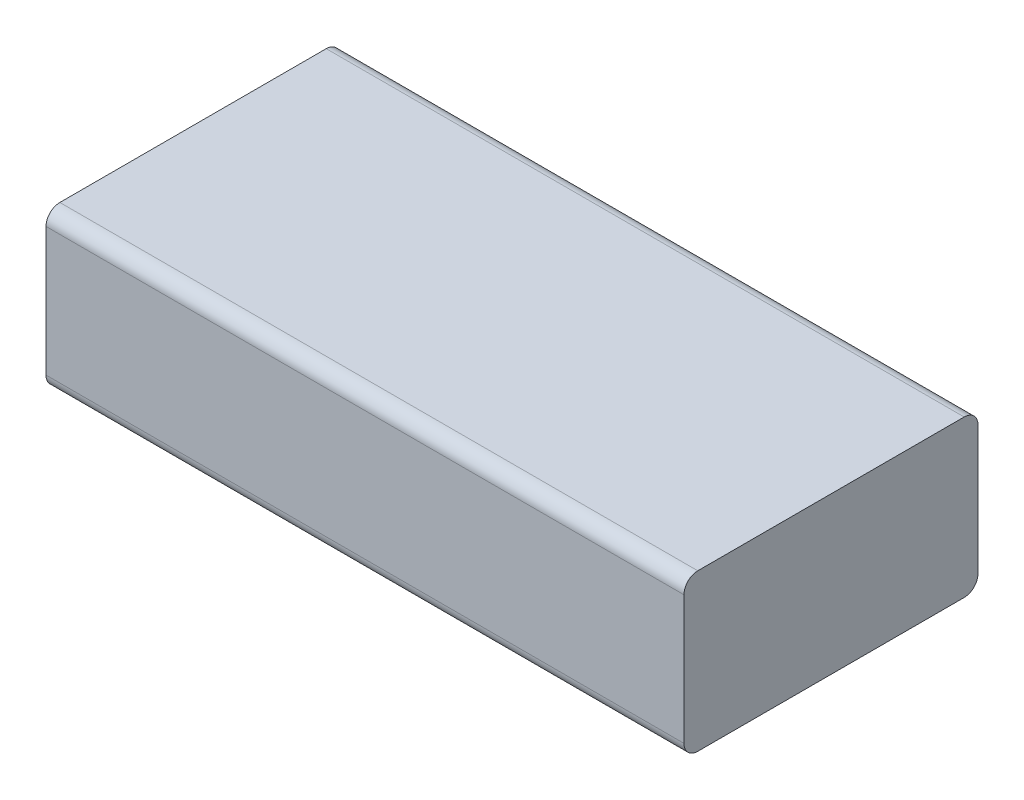
ISO-10303-21;
HEADER;
FILE_DESCRIPTION(('STEP AP214'),'2;1');
FILE_NAME('part.step','',(''),(''),'','','');
FILE_SCHEMA(('AUTOMOTIVE_DESIGN { 1 0 10303 214 1 1 1 1 }'));
ENDSEC;
DATA;
#1=APPLICATION_CONTEXT('core data for automotive mechanical design processes');
#2=APPLICATION_PROTOCOL_DEFINITION('international standard','automotive_design',2000,#1);
#3=PRODUCT_CONTEXT('',#1,'mechanical');
#4=PRODUCT('Part','Part','',(#3));
#5=PRODUCT_RELATED_PRODUCT_CATEGORY('part','',(#4));
#6=PRODUCT_DEFINITION_FORMATION('','',#4);
#7=PRODUCT_DEFINITION_CONTEXT('part definition',#1,'design');
#8=PRODUCT_DEFINITION('design','',#6,#7);
#9=PRODUCT_DEFINITION_SHAPE('','',#8);
#10=(LENGTH_UNIT() NAMED_UNIT(*) SI_UNIT(.MILLI.,.METRE.));
#11=(NAMED_UNIT(*) PLANE_ANGLE_UNIT() SI_UNIT($,.RADIAN.));
#12=(NAMED_UNIT(*) SI_UNIT($,.STERADIAN.) SOLID_ANGLE_UNIT());
#13=UNCERTAINTY_MEASURE_WITH_UNIT(LENGTH_MEASURE(1.E-05),#10,'distance_accuracy_value','');
#14=(GEOMETRIC_REPRESENTATION_CONTEXT(3) GLOBAL_UNCERTAINTY_ASSIGNED_CONTEXT((#13)) GLOBAL_UNIT_ASSIGNED_CONTEXT((#10,
#11,#12)) REPRESENTATION_CONTEXT('',''));
#15=CARTESIAN_POINT('',(0.,0.,0.));
#16=DIRECTION('',(0.,0.,1.));
#17=DIRECTION('',(1.,0.,0.));
#18=AXIS2_PLACEMENT_3D('',#15,#16,#17);
#19=CARTESIAN_POINT('',(-46.1,22.6,21.25));
#20=DIRECTION('',(1.,0.,0.));
#21=DIRECTION('',(0.,0.,-1.));
#22=AXIS2_PLACEMENT_3D('',#19,#20,#21);
#23=PLANE('',#22);
#24=DIRECTION('',(0.,-1.,0.));
#25=VECTOR('',#24,1.);
#26=CARTESIAN_POINT('',(-46.1,22.6,-21.25));
#27=LINE('',#26,#25);
#28=CARTESIAN_POINT('',(-46.1,20.6,-21.25));
#29=VERTEX_POINT('',#28);
#30=CARTESIAN_POINT('',(-46.1,2.,-21.25));
#31=VERTEX_POINT('',#30);
#32=EDGE_CURVE('E184',#29,#31,#27,.T.);
#33=ORIENTED_EDGE('',*,*,#32,.T.);
#34=CARTESIAN_POINT('',(-46.1,2.,-19.25));
#35=DIRECTION('',(1.,0.,0.));
#36=DIRECTION('',(0.,0.,-1.));
#37=AXIS2_PLACEMENT_3D('',#34,#35,#36);
#38=CIRCLE('',#37,2.);
#39=CARTESIAN_POINT('',(-46.1,0.,-19.25));
#40=VERTEX_POINT('',#39);
#41=EDGE_CURVE('E201',#31,#40,#38,.F.);
#42=ORIENTED_EDGE('',*,*,#41,.T.);
#43=DIRECTION('',(0.,0.,1.));
#44=VECTOR('',#43,1.);
#45=CARTESIAN_POINT('',(-46.1,0.,21.25));
#46=LINE('',#45,#44);
#47=CARTESIAN_POINT('',(-46.1,0.,19.25));
#48=VERTEX_POINT('',#47);
#49=EDGE_CURVE('E171',#40,#48,#46,.T.);
#50=ORIENTED_EDGE('',*,*,#49,.T.);
#51=CARTESIAN_POINT('',(-46.1,2.,19.25));
#52=DIRECTION('',(1.,0.,0.));
#53=DIRECTION('',(0.,0.,-1.));
#54=AXIS2_PLACEMENT_3D('',#51,#52,#53);
#55=CIRCLE('',#54,2.);
#56=CARTESIAN_POINT('',(-46.1,2.,21.25));
#57=VERTEX_POINT('',#56);
#58=EDGE_CURVE('E199',#48,#57,#55,.F.);
#59=ORIENTED_EDGE('',*,*,#58,.T.);
#60=DIRECTION('',(0.,-1.,0.));
#61=VECTOR('',#60,1.);
#62=CARTESIAN_POINT('',(-46.1,22.6,21.25));
#63=LINE('',#62,#61);
#64=CARTESIAN_POINT('',(-46.1,20.6,21.25));
#65=VERTEX_POINT('',#64);
#66=EDGE_CURVE('E181',#65,#57,#63,.T.);
#67=ORIENTED_EDGE('',*,*,#66,.F.);
#68=CARTESIAN_POINT('',(-46.1,20.6,19.25));
#69=DIRECTION('',(1.,0.,0.));
#70=DIRECTION('',(0.,0.,-1.));
#71=AXIS2_PLACEMENT_3D('',#68,#69,#70);
#72=CIRCLE('',#71,2.);
#73=CARTESIAN_POINT('',(-46.1,22.6,19.25));
#74=VERTEX_POINT('',#73);
#75=EDGE_CURVE('E195',#65,#74,#72,.F.);
#76=ORIENTED_EDGE('',*,*,#75,.T.);
#77=DIRECTION('',(0.,0.,1.));
#78=VECTOR('',#77,1.);
#79=CARTESIAN_POINT('',(-46.1,22.6,21.25));
#80=LINE('',#79,#78);
#81=CARTESIAN_POINT('',(-46.1,22.6,-19.25));
#82=VERTEX_POINT('',#81);
#83=EDGE_CURVE('E170',#82,#74,#80,.T.);
#84=ORIENTED_EDGE('',*,*,#83,.F.);
#85=CARTESIAN_POINT('',(-46.1,20.6,-19.25));
#86=DIRECTION('',(1.,0.,0.));
#87=DIRECTION('',(0.,0.,-1.));
#88=AXIS2_PLACEMENT_3D('',#85,#86,#87);
#89=CIRCLE('',#88,2.);
#90=EDGE_CURVE('E197',#82,#29,#89,.F.);
#91=ORIENTED_EDGE('',*,*,#90,.T.);
#92=EDGE_LOOP('',(#33,#42,#50,#59,#67,#76,#84,#91));
#93=FACE_BOUND('',#92,.T.);
#94=CARTESIAN_POINT('',(-46.1,4.,-16.));
#95=DIRECTION('',(1.,0.,0.));
#96=DIRECTION('',(0.,0.,-1.));
#97=AXIS2_PLACEMENT_3D('',#94,#95,#96);
#98=CIRCLE('',#97,1.5);
#99=CARTESIAN_POINT('',(-46.1,4.,-17.5));
#100=VERTEX_POINT('',#99);
#101=EDGE_CURVE('E11',#100,#100,#98,.F.);
#102=ORIENTED_EDGE('',*,*,#101,.F.);
#103=EDGE_LOOP('',(#102));
#104=FACE_BOUND('',#103,.T.);
#105=DIRECTION('',(0.,0.,1.));
#106=VECTOR('',#105,1.);
#107=CARTESIAN_POINT('',(-46.1,11.6,0.));
#108=LINE('',#107,#106);
#109=CARTESIAN_POINT('',(-46.1,11.6,0.));
#110=VERTEX_POINT('',#109);
#111=CARTESIAN_POINT('',(-46.1,11.6,15.));
#112=VERTEX_POINT('',#111);
#113=EDGE_CURVE('E156',#110,#112,#108,.T.);
#114=ORIENTED_EDGE('',*,*,#113,.F.);
#115=DIRECTION('',(0.,1.,0.));
#116=VECTOR('',#115,1.);
#117=CARTESIAN_POINT('',(-46.1,0.,0.));
#118=LINE('',#117,#116);
#119=CARTESIAN_POINT('',(-46.1,17.6,0.));
#120=VERTEX_POINT('',#119);
#121=EDGE_CURVE('E152',#110,#120,#118,.T.);
#122=ORIENTED_EDGE('',*,*,#121,.T.);
#123=DIRECTION('',(0.,0.,1.));
#124=VECTOR('',#123,1.);
#125=CARTESIAN_POINT('',(-46.1,17.6,0.));
#126=LINE('',#125,#124);
#127=CARTESIAN_POINT('',(-46.1,17.6,15.));
#128=VERTEX_POINT('',#127);
#129=EDGE_CURVE('E58',#120,#128,#126,.T.);
#130=ORIENTED_EDGE('',*,*,#129,.T.);
#131=DIRECTION('',(0.,1.,0.));
#132=VECTOR('',#131,1.);
#133=CARTESIAN_POINT('',(-46.1,0.,15.));
#134=LINE('',#133,#132);
#135=EDGE_CURVE('E383',#112,#128,#134,.T.);
#136=ORIENTED_EDGE('',*,*,#135,.F.);
#137=EDGE_LOOP('',(#114,#122,#130,#136));
#138=FACE_BOUND('',#137,.T.);
#139=ADVANCED_FACE('F43',(#93,#104,#138),#23,.F.);
#140=CARTESIAN_POINT('',(46.1,22.6,21.25));
#141=DIRECTION('',(-1.,0.,0.));
#142=DIRECTION('',(0.,0.,1.));
#143=AXIS2_PLACEMENT_3D('',#140,#141,#142);
#144=PLANE('',#143);
#145=DIRECTION('',(0.,0.,-1.));
#146=VECTOR('',#145,1.);
#147=CARTESIAN_POINT('',(46.1,0.,21.25));
#148=LINE('',#147,#146);
#149=CARTESIAN_POINT('',(46.1,0.,19.25));
#150=VERTEX_POINT('',#149);
#151=CARTESIAN_POINT('',(46.1,0.,-19.25));
#152=VERTEX_POINT('',#151);
#153=EDGE_CURVE('E161',#150,#152,#148,.T.);
#154=ORIENTED_EDGE('',*,*,#153,.T.);
#155=CARTESIAN_POINT('',(46.1,2.,-19.25));
#156=DIRECTION('',(-1.,0.,0.));
#157=DIRECTION('',(0.,0.,1.));
#158=AXIS2_PLACEMENT_3D('',#155,#156,#157);
#159=CIRCLE('',#158,2.);
#160=CARTESIAN_POINT('',(46.1,2.,-21.25));
#161=VERTEX_POINT('',#160);
#162=EDGE_CURVE('E212',#152,#161,#159,.F.);
#163=ORIENTED_EDGE('',*,*,#162,.T.);
#164=DIRECTION('',(0.,-1.,0.));
#165=VECTOR('',#164,1.);
#166=CARTESIAN_POINT('',(46.1,22.6,-21.25));
#167=LINE('',#166,#165);
#168=CARTESIAN_POINT('',(46.1,20.6,-21.25));
#169=VERTEX_POINT('',#168);
#170=EDGE_CURVE('E187',#169,#161,#167,.T.);
#171=ORIENTED_EDGE('',*,*,#170,.F.);
#172=CARTESIAN_POINT('',(46.1,20.6,-19.25));
#173=DIRECTION('',(-1.,0.,0.));
#174=DIRECTION('',(0.,0.,1.));
#175=AXIS2_PLACEMENT_3D('',#172,#173,#174);
#176=CIRCLE('',#175,2.);
#177=CARTESIAN_POINT('',(46.1,22.6,-19.25));
#178=VERTEX_POINT('',#177);
#179=EDGE_CURVE('E209',#169,#178,#176,.F.);
#180=ORIENTED_EDGE('',*,*,#179,.T.);
#181=DIRECTION('',(0.,0.,-1.));
#182=VECTOR('',#181,1.);
#183=CARTESIAN_POINT('',(46.1,22.6,21.25));
#184=LINE('',#183,#182);
#185=CARTESIAN_POINT('',(46.1,22.6,19.25));
#186=VERTEX_POINT('',#185);
#187=EDGE_CURVE('E167',#186,#178,#184,.T.);
#188=ORIENTED_EDGE('',*,*,#187,.F.);
#189=CARTESIAN_POINT('',(46.1,20.6,19.25));
#190=DIRECTION('',(-1.,0.,0.));
#191=DIRECTION('',(0.,0.,1.));
#192=AXIS2_PLACEMENT_3D('',#189,#190,#191);
#193=CIRCLE('',#192,2.);
#194=CARTESIAN_POINT('',(46.1,20.6,21.25));
#195=VERTEX_POINT('',#194);
#196=EDGE_CURVE('E207',#186,#195,#193,.F.);
#197=ORIENTED_EDGE('',*,*,#196,.T.);
#198=DIRECTION('',(0.,-1.,0.));
#199=VECTOR('',#198,1.);
#200=CARTESIAN_POINT('',(46.1,22.6,21.25));
#201=LINE('',#200,#199);
#202=CARTESIAN_POINT('',(46.1,2.,21.25));
#203=VERTEX_POINT('',#202);
#204=EDGE_CURVE('E174',#195,#203,#201,.T.);
#205=ORIENTED_EDGE('',*,*,#204,.T.);
#206=CARTESIAN_POINT('',(46.1,2.,19.25));
#207=DIRECTION('',(-1.,0.,0.));
#208=DIRECTION('',(0.,0.,1.));
#209=AXIS2_PLACEMENT_3D('',#206,#207,#208);
#210=CIRCLE('',#209,2.);
#211=EDGE_CURVE('E66',#203,#150,#210,.F.);
#212=ORIENTED_EDGE('',*,*,#211,.T.);
#213=EDGE_LOOP('',(#154,#163,#171,#180,#188,#197,#205,#212));
#214=FACE_BOUND('',#213,.T.);
#215=ADVANCED_FACE('F237',(#214),#144,.F.);
#216=CARTESIAN_POINT('',(-46.1,22.6,-21.25));
#217=DIRECTION('',(0.,0.,1.));
#218=DIRECTION('',(1.,0.,0.));
#219=AXIS2_PLACEMENT_3D('',#216,#217,#218);
#220=PLANE('',#219);
#221=ORIENTED_EDGE('',*,*,#170,.T.);
#222=DIRECTION('',(-1.,0.,0.));
#223=VECTOR('',#222,1.);
#224=CARTESIAN_POINT('',(-46.1,2.,-21.25));
#225=LINE('',#224,#223);
#226=EDGE_CURVE('E192',#161,#31,#225,.T.);
#227=ORIENTED_EDGE('',*,*,#226,.T.);
#228=ORIENTED_EDGE('',*,*,#32,.F.);
#229=DIRECTION('',(-1.,0.,0.));
#230=VECTOR('',#229,1.);
#231=CARTESIAN_POINT('',(-46.1,20.6,-21.25));
#232=LINE('',#231,#230);
#233=EDGE_CURVE('E190',#29,#169,#232,.F.);
#234=ORIENTED_EDGE('',*,*,#233,.T.);
#235=EDGE_LOOP('',(#221,#227,#228,#234));
#236=FACE_BOUND('',#235,.T.);
#237=ADVANCED_FACE('F243',(#236),#220,.F.);
#238=CARTESIAN_POINT('',(-46.1,22.6,21.25));
#239=DIRECTION('',(0.,0.,-1.));
#240=DIRECTION('',(-1.,0.,0.));
#241=AXIS2_PLACEMENT_3D('',#238,#239,#240);
#242=PLANE('',#241);
#243=ORIENTED_EDGE('',*,*,#66,.T.);
#244=DIRECTION('',(1.,0.,0.));
#245=VECTOR('',#244,1.);
#246=CARTESIAN_POINT('',(46.1,2.,21.25));
#247=LINE('',#246,#245);
#248=EDGE_CURVE('E216',#57,#203,#247,.T.);
#249=ORIENTED_EDGE('',*,*,#248,.T.);
#250=ORIENTED_EDGE('',*,*,#204,.F.);
#251=DIRECTION('',(1.,0.,0.));
#252=VECTOR('',#251,1.);
#253=CARTESIAN_POINT('',(-46.1,20.6,21.25));
#254=LINE('',#253,#252);
#255=EDGE_CURVE('E214',#195,#65,#254,.F.);
#256=ORIENTED_EDGE('',*,*,#255,.T.);
#257=EDGE_LOOP('',(#243,#249,#250,#256));
#258=FACE_BOUND('',#257,.T.);
#259=ADVANCED_FACE('F256',(#258),#242,.F.);
#260=CARTESIAN_POINT('',(0.,22.6,0.));
#261=DIRECTION('',(0.,-1.,0.));
#262=DIRECTION('',(0.,0.,-1.));
#263=AXIS2_PLACEMENT_3D('',#260,#261,#262);
#264=PLANE('',#263);
#265=ORIENTED_EDGE('',*,*,#187,.T.);
#266=DIRECTION('',(-1.,0.,0.));
#267=VECTOR('',#266,1.);
#268=CARTESIAN_POINT('',(0.,22.6,-19.25));
#269=LINE('',#268,#267);
#270=EDGE_CURVE('E51',#178,#82,#269,.T.);
#271=ORIENTED_EDGE('',*,*,#270,.T.);
#272=ORIENTED_EDGE('',*,*,#83,.T.);
#273=DIRECTION('',(1.,0.,0.));
#274=VECTOR('',#273,1.);
#275=CARTESIAN_POINT('',(0.,22.6,19.25));
#276=LINE('',#275,#274);
#277=EDGE_CURVE('E218',#74,#186,#276,.T.);
#278=ORIENTED_EDGE('',*,*,#277,.T.);
#279=EDGE_LOOP('',(#265,#271,#272,#278));
#280=FACE_BOUND('',#279,.T.);
#281=ADVANCED_FACE('F224',(#280),#264,.F.);
#282=CARTESIAN_POINT('',(0.,0.,0.));
#283=DIRECTION('',(0.,-1.,0.));
#284=DIRECTION('',(0.,0.,-1.));
#285=AXIS2_PLACEMENT_3D('',#282,#283,#284);
#286=PLANE('',#285);
#287=ORIENTED_EDGE('',*,*,#49,.F.);
#288=DIRECTION('',(-1.,0.,0.));
#289=VECTOR('',#288,1.);
#290=CARTESIAN_POINT('',(46.1,0.,-19.25));
#291=LINE('',#290,#289);
#292=EDGE_CURVE('E205',#40,#152,#291,.F.);
#293=ORIENTED_EDGE('',*,*,#292,.T.);
#294=ORIENTED_EDGE('',*,*,#153,.F.);
#295=DIRECTION('',(1.,0.,0.));
#296=VECTOR('',#295,1.);
#297=CARTESIAN_POINT('',(-46.1,0.,19.25));
#298=LINE('',#297,#296);
#299=EDGE_CURVE('E203',#150,#48,#298,.F.);
#300=ORIENTED_EDGE('',*,*,#299,.T.);
#301=EDGE_LOOP('',(#287,#293,#294,#300));
#302=FACE_BOUND('',#301,.T.);
#303=ADVANCED_FACE('F250',(#302),#286,.T.);
#304=CARTESIAN_POINT('',(-46.1,2.,-19.25));
#305=DIRECTION('',(1.,0.,0.));
#306=DIRECTION('',(0.,0.,-1.));
#307=AXIS2_PLACEMENT_3D('',#304,#305,#306);
#308=CYLINDRICAL_SURFACE('',#307,2.);
#309=ORIENTED_EDGE('',*,*,#162,.F.);
#310=ORIENTED_EDGE('',*,*,#292,.F.);
#311=ORIENTED_EDGE('',*,*,#41,.F.);
#312=ORIENTED_EDGE('',*,*,#226,.F.);
#313=EDGE_LOOP('',(#309,#310,#311,#312));
#314=FACE_BOUND('',#313,.T.);
#315=ADVANCED_FACE('F253',(#314),#308,.T.);
#316=CARTESIAN_POINT('',(-46.1,2.,19.25));
#317=DIRECTION('',(-1.,0.,0.));
#318=DIRECTION('',(0.,0.,1.));
#319=AXIS2_PLACEMENT_3D('',#316,#317,#318);
#320=CYLINDRICAL_SURFACE('',#319,2.);
#321=ORIENTED_EDGE('',*,*,#58,.F.);
#322=ORIENTED_EDGE('',*,*,#299,.F.);
#323=ORIENTED_EDGE('',*,*,#211,.F.);
#324=ORIENTED_EDGE('',*,*,#248,.F.);
#325=EDGE_LOOP('',(#321,#322,#323,#324));
#326=FACE_BOUND('',#325,.T.);
#327=ADVANCED_FACE('F254',(#326),#320,.T.);
#328=CARTESIAN_POINT('',(0.,20.6,-19.25));
#329=DIRECTION('',(-1.,0.,0.));
#330=DIRECTION('',(0.,0.,1.));
#331=AXIS2_PLACEMENT_3D('',#328,#329,#330);
#332=CYLINDRICAL_SURFACE('',#331,2.);
#333=ORIENTED_EDGE('',*,*,#179,.F.);
#334=ORIENTED_EDGE('',*,*,#233,.F.);
#335=ORIENTED_EDGE('',*,*,#90,.F.);
#336=ORIENTED_EDGE('',*,*,#270,.F.);
#337=EDGE_LOOP('',(#333,#334,#335,#336));
#338=FACE_BOUND('',#337,.T.);
#339=ADVANCED_FACE('F241',(#338),#332,.T.);
#340=CARTESIAN_POINT('',(0.,20.6,19.25));
#341=DIRECTION('',(1.,0.,0.));
#342=DIRECTION('',(0.,0.,-1.));
#343=AXIS2_PLACEMENT_3D('',#340,#341,#342);
#344=CYLINDRICAL_SURFACE('',#343,2.);
#345=ORIENTED_EDGE('',*,*,#75,.F.);
#346=ORIENTED_EDGE('',*,*,#255,.F.);
#347=ORIENTED_EDGE('',*,*,#196,.F.);
#348=ORIENTED_EDGE('',*,*,#277,.F.);
#349=EDGE_LOOP('',(#345,#346,#347,#348));
#350=FACE_BOUND('',#349,.T.);
#351=ADVANCED_FACE('F45',(#350),#344,.T.);
#352=CARTESIAN_POINT('',(-49.1,4.,-16.));
#353=DIRECTION('',(1.,0.,0.));
#354=DIRECTION('',(0.,0.,-1.));
#355=AXIS2_PLACEMENT_3D('',#352,#353,#354);
#356=CYLINDRICAL_SURFACE('',#355,1.5);
#357=CARTESIAN_POINT('',(-49.1,4.,-16.));
#358=DIRECTION('',(-1.,0.,0.));
#359=DIRECTION('',(0.,0.,1.));
#360=AXIS2_PLACEMENT_3D('',#357,#358,#359);
#361=CIRCLE('',#360,1.5);
#362=CARTESIAN_POINT('',(-49.1,4.,-14.5));
#363=VERTEX_POINT('',#362);
#364=EDGE_CURVE('E158',#363,#363,#361,.T.);
#365=ORIENTED_EDGE('',*,*,#364,.F.);
#366=EDGE_LOOP('',(#365));
#367=FACE_BOUND('',#366,.T.);
#368=ORIENTED_EDGE('',*,*,#101,.T.);
#369=EDGE_LOOP('',(#368));
#370=FACE_BOUND('',#369,.T.);
#371=ADVANCED_FACE('F281',(#367,#370),#356,.T.);
#372=CARTESIAN_POINT('',(-49.1,0.,0.));
#373=DIRECTION('',(-1.,0.,0.));
#374=DIRECTION('',(0.,0.,1.));
#375=AXIS2_PLACEMENT_3D('',#372,#373,#374);
#376=PLANE('',#375);
#377=ORIENTED_EDGE('',*,*,#364,.T.);
#378=EDGE_LOOP('',(#377));
#379=FACE_BOUND('',#378,.T.);
#380=ADVANCED_FACE('F284',(#379),#376,.T.);
#381=CARTESIAN_POINT('',(-49.1,11.6,0.));
#382=DIRECTION('',(0.,1.,0.));
#383=DIRECTION('',(0.,0.,1.));
#384=AXIS2_PLACEMENT_3D('',#381,#382,#383);
#385=PLANE('',#384);
#386=ORIENTED_EDGE('',*,*,#113,.T.);
#387=DIRECTION('',(1.,0.,0.));
#388=VECTOR('',#387,1.);
#389=CARTESIAN_POINT('',(-49.1,11.6,15.));
#390=LINE('',#389,#388);
#391=CARTESIAN_POINT('',(-49.1,11.6,15.));
#392=VERTEX_POINT('',#391);
#393=EDGE_CURVE('E137',#392,#112,#390,.T.);
#394=ORIENTED_EDGE('',*,*,#393,.F.);
#395=DIRECTION('',(0.,0.,1.));
#396=VECTOR('',#395,1.);
#397=CARTESIAN_POINT('',(-49.1,11.6,0.));
#398=LINE('',#397,#396);
#399=CARTESIAN_POINT('',(-49.1,11.6,0.));
#400=VERTEX_POINT('',#399);
#401=EDGE_CURVE('E144',#400,#392,#398,.T.);
#402=ORIENTED_EDGE('',*,*,#401,.F.);
#403=DIRECTION('',(1.,0.,0.));
#404=VECTOR('',#403,1.);
#405=CARTESIAN_POINT('',(-49.1,11.6,0.));
#406=LINE('',#405,#404);
#407=EDGE_CURVE('E380',#400,#110,#406,.T.);
#408=ORIENTED_EDGE('',*,*,#407,.T.);
#409=EDGE_LOOP('',(#386,#394,#402,#408));
#410=FACE_BOUND('',#409,.T.);
#411=ADVANCED_FACE('F154',(#410),#385,.F.);
#412=CARTESIAN_POINT('',(-49.1,0.,15.));
#413=DIRECTION('',(0.,0.,-1.));
#414=DIRECTION('',(-1.,0.,0.));
#415=AXIS2_PLACEMENT_3D('',#412,#413,#414);
#416=PLANE('',#415);
#417=ORIENTED_EDGE('',*,*,#135,.T.);
#418=DIRECTION('',(1.,0.,0.));
#419=VECTOR('',#418,1.);
#420=CARTESIAN_POINT('',(-49.1,17.6,15.));
#421=LINE('',#420,#419);
#422=CARTESIAN_POINT('',(-49.1,17.6,15.));
#423=VERTEX_POINT('',#422);
#424=EDGE_CURVE('E139',#423,#128,#421,.T.);
#425=ORIENTED_EDGE('',*,*,#424,.F.);
#426=DIRECTION('',(0.,1.,0.));
#427=VECTOR('',#426,1.);
#428=CARTESIAN_POINT('',(-49.1,0.,15.));
#429=LINE('',#428,#427);
#430=EDGE_CURVE('E132',#392,#423,#429,.T.);
#431=ORIENTED_EDGE('',*,*,#430,.F.);
#432=ORIENTED_EDGE('',*,*,#393,.T.);
#433=EDGE_LOOP('',(#417,#425,#431,#432));
#434=FACE_BOUND('',#433,.T.);
#435=ADVANCED_FACE('F135',(#434),#416,.F.);
#436=CARTESIAN_POINT('',(-49.1,17.6,0.));
#437=DIRECTION('',(0.,1.,0.));
#438=DIRECTION('',(0.,0.,1.));
#439=AXIS2_PLACEMENT_3D('',#436,#437,#438);
#440=PLANE('',#439);
#441=ORIENTED_EDGE('',*,*,#129,.F.);
#442=DIRECTION('',(1.,0.,0.));
#443=VECTOR('',#442,1.);
#444=CARTESIAN_POINT('',(-49.1,17.6,0.));
#445=LINE('',#444,#443);
#446=CARTESIAN_POINT('',(-49.1,17.6,0.));
#447=VERTEX_POINT('',#446);
#448=EDGE_CURVE('E163',#447,#120,#445,.T.);
#449=ORIENTED_EDGE('',*,*,#448,.F.);
#450=DIRECTION('',(0.,0.,1.));
#451=VECTOR('',#450,1.);
#452=CARTESIAN_POINT('',(-49.1,17.6,0.));
#453=LINE('',#452,#451);
#454=EDGE_CURVE('E143',#447,#423,#453,.T.);
#455=ORIENTED_EDGE('',*,*,#454,.T.);
#456=ORIENTED_EDGE('',*,*,#424,.T.);
#457=EDGE_LOOP('',(#441,#449,#455,#456));
#458=FACE_BOUND('',#457,.T.);
#459=ADVANCED_FACE('F349',(#458),#440,.T.);
#460=CARTESIAN_POINT('',(-49.1,0.,0.));
#461=DIRECTION('',(0.,0.,-1.));
#462=DIRECTION('',(-1.,0.,0.));
#463=AXIS2_PLACEMENT_3D('',#460,#461,#462);
#464=PLANE('',#463);
#465=ORIENTED_EDGE('',*,*,#121,.F.);
#466=ORIENTED_EDGE('',*,*,#407,.F.);
#467=DIRECTION('',(0.,1.,0.));
#468=VECTOR('',#467,1.);
#469=CARTESIAN_POINT('',(-49.1,0.,0.));
#470=LINE('',#469,#468);
#471=EDGE_CURVE('E150',#400,#447,#470,.T.);
#472=ORIENTED_EDGE('',*,*,#471,.T.);
#473=ORIENTED_EDGE('',*,*,#448,.T.);
#474=EDGE_LOOP('',(#465,#466,#472,#473));
#475=FACE_BOUND('',#474,.T.);
#476=ADVANCED_FACE('F358',(#475),#464,.T.);
#477=CARTESIAN_POINT('',(-49.1,0.,0.));
#478=DIRECTION('',(-1.,0.,0.));
#479=DIRECTION('',(0.,0.,1.));
#480=AXIS2_PLACEMENT_3D('',#477,#478,#479);
#481=PLANE('',#480);
#482=ORIENTED_EDGE('',*,*,#401,.T.);
#483=ORIENTED_EDGE('',*,*,#430,.T.);
#484=ORIENTED_EDGE('',*,*,#454,.F.);
#485=ORIENTED_EDGE('',*,*,#471,.F.);
#486=EDGE_LOOP('',(#482,#483,#484,#485));
#487=FACE_BOUND('',#486,.T.);
#488=ADVANCED_FACE('F148',(#487),#481,.T.);
#489=CLOSED_SHELL('',(#139,#215,#237,#259,#281,#303,#315,#327,#339,#351,#371,#380,#411,#435,
#459,#476,#488));
#490=MANIFOLD_SOLID_BREP('B2',#489);
#491=ADVANCED_BREP_SHAPE_REPRESENTATION('',(#18,#490),#14);
#492=SHAPE_DEFINITION_REPRESENTATION(#9,#491);
ENDSEC;
END-ISO-10303-21;
